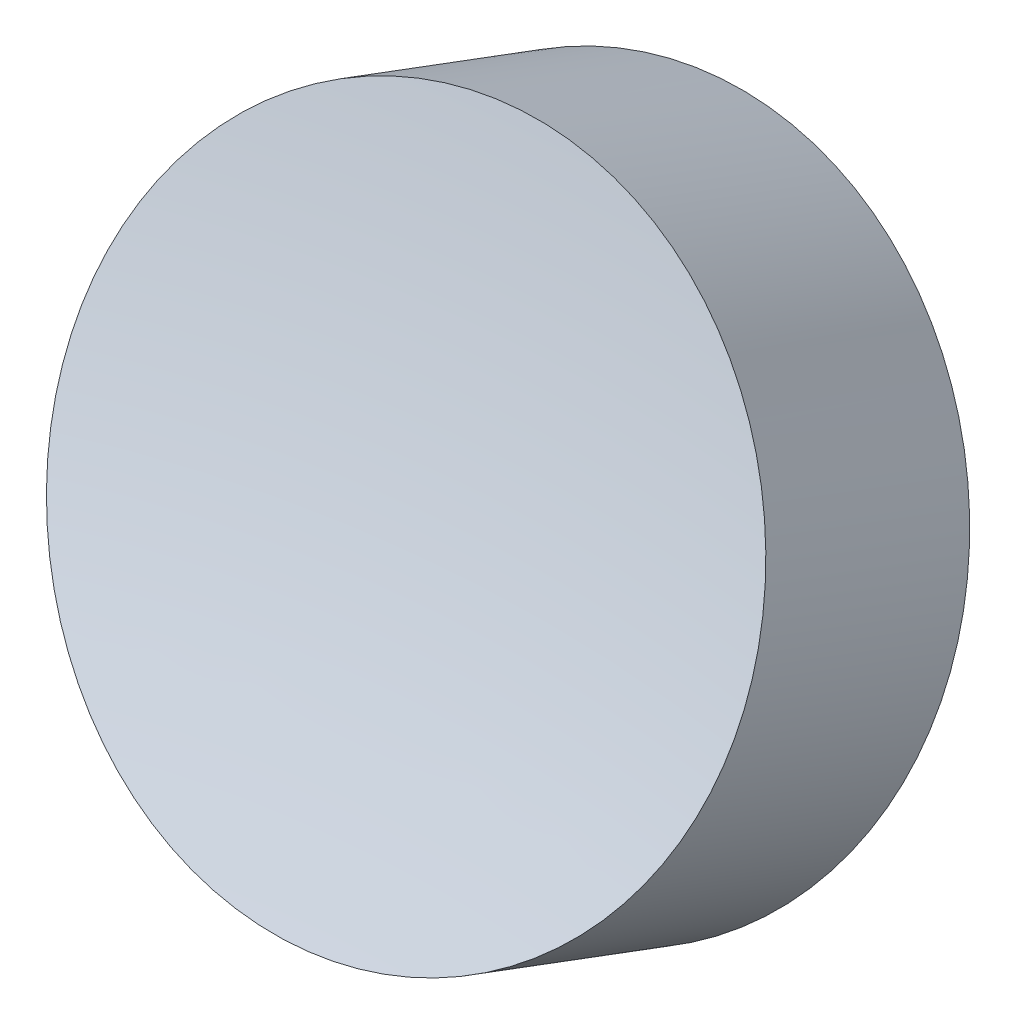
ISO-10303-21;
HEADER;
FILE_DESCRIPTION(('STEP AP214'),'2;1');
FILE_NAME('part.step','',(''),(''),'','','');
FILE_SCHEMA(('AUTOMOTIVE_DESIGN { 1 0 10303 214 1 1 1 1 }'));
ENDSEC;
DATA;
#1=APPLICATION_CONTEXT('core data for automotive mechanical design processes');
#2=APPLICATION_PROTOCOL_DEFINITION('international standard','automotive_design',2000,#1);
#3=PRODUCT_CONTEXT('',#1,'mechanical');
#4=PRODUCT('Part','Part','',(#3));
#5=PRODUCT_RELATED_PRODUCT_CATEGORY('part','',(#4));
#6=PRODUCT_DEFINITION_FORMATION('','',#4);
#7=PRODUCT_DEFINITION_CONTEXT('part definition',#1,'design');
#8=PRODUCT_DEFINITION('design','',#6,#7);
#9=PRODUCT_DEFINITION_SHAPE('','',#8);
#10=(LENGTH_UNIT() NAMED_UNIT(*) SI_UNIT(.MILLI.,.METRE.));
#11=(NAMED_UNIT(*) PLANE_ANGLE_UNIT() SI_UNIT($,.RADIAN.));
#12=(NAMED_UNIT(*) SI_UNIT($,.STERADIAN.) SOLID_ANGLE_UNIT());
#13=UNCERTAINTY_MEASURE_WITH_UNIT(LENGTH_MEASURE(1.E-05),#10,'distance_accuracy_value','');
#14=(GEOMETRIC_REPRESENTATION_CONTEXT(3) GLOBAL_UNCERTAINTY_ASSIGNED_CONTEXT((#13)) GLOBAL_UNIT_ASSIGNED_CONTEXT((#10,
#11,#12)) REPRESENTATION_CONTEXT('',''));
#15=CARTESIAN_POINT('',(0.,0.,0.));
#16=DIRECTION('',(0.,0.,1.));
#17=DIRECTION('',(1.,0.,0.));
#18=AXIS2_PLACEMENT_3D('',#15,#16,#17);
#19=CARTESIAN_POINT('',(-2.03871082646788,142.48814292537,346.880327692149));
#20=DIRECTION('',(0.0622709564623499,0.383014202525075,0.921641171305484));
#21=DIRECTION('',(0.,-0.923433296037534,0.383758970930005));
#22=AXIS2_PLACEMENT_3D('',#19,#20,#21);
#23=CYLINDRICAL_SURFACE('',#22,12.5000000000002);
#24=CARTESIAN_POINT('',(-2.61398281011595,138.949778452276,338.366015805047));
#25=DIRECTION('',(0.0622709564623499,0.383014202525075,0.921641171305484));
#26=DIRECTION('',(0.,-0.923433296037534,0.383758970930005));
#27=AXIS2_PLACEMENT_3D('',#24,#25,#26);
#28=CIRCLE('',#27,12.5000000000004);
#29=CARTESIAN_POINT('',(-2.61398281011595,127.406862251806,343.163002941672));
#30=VERTEX_POINT('',#29);
#31=EDGE_CURVE('E10',#30,#30,#28,.T.);
#32=ORIENTED_EDGE('',*,*,#31,.F.);
#33=EDGE_LOOP('',(#32));
#34=FACE_BOUND('',#33,.T.);
#35=CARTESIAN_POINT('',(-2.02936433778751,142.545631008285,347.018660379879));
#36=DIRECTION('',(0.0622709564623499,0.383014202525075,0.921641171305484));
#37=DIRECTION('',(0.,-0.923433296037534,0.383758970930005));
#38=AXIS2_PLACEMENT_3D('',#35,#36,#37);
#39=CIRCLE('',#38,12.5);
#40=CARTESIAN_POINT('',(-2.02936433778751,131.002714807816,351.815647516504));
#41=VERTEX_POINT('',#40);
#42=EDGE_CURVE('E46',#41,#41,#39,.T.);
#43=ORIENTED_EDGE('',*,*,#42,.T.);
#44=EDGE_LOOP('',(#43));
#45=FACE_BOUND('',#44,.T.);
#46=ADVANCED_FACE('F32',(#34,#45),#23,.F.);
#47=CARTESIAN_POINT('',(9.86175819982345,138.65106547514,337.647227372878));
#48=DIRECTION('',(0.0622709564623499,0.383014202525075,0.921641171305484));
#49=DIRECTION('',(0.,-0.923433296037534,0.383758970930005));
#50=AXIS2_PLACEMENT_3D('',#47,#48,#49);
#51=PLANE('',#50);
#52=CARTESIAN_POINT('',(-2.61398281011594,138.949778452276,338.366015805047));
#53=DIRECTION('',(0.0622709564623499,0.383014202525075,0.921641171305484));
#54=DIRECTION('',(0.,-0.923433296037534,0.383758970930005));
#55=AXIS2_PLACEMENT_3D('',#52,#53,#54);
#56=CIRCLE('',#55,13.5000000000004);
#57=CARTESIAN_POINT('',(-2.61398281011594,126.483428955769,343.546761912602));
#58=VERTEX_POINT('',#57);
#59=EDGE_CURVE('E38',#58,#58,#56,.T.);
#60=ORIENTED_EDGE('',*,*,#59,.F.);
#61=EDGE_LOOP('',(#60));
#62=FACE_BOUND('',#61,.T.);
#63=ORIENTED_EDGE('',*,*,#31,.T.);
#64=EDGE_LOOP('',(#63));
#65=FACE_BOUND('',#64,.T.);
#66=ADVANCED_FACE('F64',(#62,#65),#51,.F.);
#67=CARTESIAN_POINT('',(-2.03871082646788,142.48814292537,346.880327692149));
#68=DIRECTION('',(0.0622709564623499,0.383014202525075,0.921641171305484));
#69=DIRECTION('',(0.,-0.923433296037534,0.383758970930005));
#70=AXIS2_PLACEMENT_3D('',#67,#68,#69);
#71=CYLINDRICAL_SURFACE('',#70,13.5000000000002);
#72=CARTESIAN_POINT('',(-1.99127324549244,142.779920477526,347.582427518101));
#73=DIRECTION('',(0.0622709564623499,0.383014202525075,0.921641171305484));
#74=DIRECTION('',(0.,-0.923433296037534,0.383758970930005));
#75=AXIS2_PLACEMENT_3D('',#72,#73,#74);
#76=CIRCLE('',#75,13.4999999999999);
#77=CARTESIAN_POINT('',(-1.99127324549244,130.31357098102,352.763173625657));
#78=VERTEX_POINT('',#77);
#79=EDGE_CURVE('E42',#78,#78,#76,.T.);
#80=ORIENTED_EDGE('',*,*,#79,.F.);
#81=EDGE_LOOP('',(#80));
#82=FACE_BOUND('',#81,.T.);
#83=ORIENTED_EDGE('',*,*,#59,.T.);
#84=EDGE_LOOP('',(#83));
#85=FACE_BOUND('',#84,.T.);
#86=ADVANCED_FACE('F60',(#82,#85),#71,.T.);
#87=CARTESIAN_POINT('',(5.43380394900818,188.449847228379,457.477268248808));
#88=DIRECTION('',(0.0622709564623499,0.383014202525075,0.921641171305484));
#89=DIRECTION('',(0.998059280795116,-0.0238970381708184,-0.0575030745734376));
#90=AXIS2_PLACEMENT_3D('',#87,#88,#89);
#91=SPHERICAL_SURFACE('',#90,120.);
#92=ORIENTED_EDGE('',*,*,#79,.T.);
#93=EDGE_LOOP('',(#92));
#94=FACE_BOUND('',#93,.T.);
#95=ADVANCED_FACE('F55',(#94),#91,.F.);
#96=CARTESIAN_POINT('',(5.43380394900818,188.449847228379,457.477268248808));
#97=DIRECTION('',(0.0622709564623499,0.383014202525075,0.921641171305484));
#98=DIRECTION('',(0.998059280795116,-0.0238970381708184,-0.0575030745734376));
#99=AXIS2_PLACEMENT_3D('',#96,#97,#98);
#100=SPHERICAL_SURFACE('',#99,120.5);
#101=ORIENTED_EDGE('',*,*,#42,.F.);
#102=EDGE_LOOP('',(#101));
#103=FACE_BOUND('',#102,.T.);
#104=ADVANCED_FACE('F53',(#103),#100,.T.);
#105=CLOSED_SHELL('',(#46,#66,#86,#95,#104));
#106=MANIFOLD_SOLID_BREP('B2',#105);
#107=ADVANCED_BREP_SHAPE_REPRESENTATION('',(#18,#106),#14);
#108=SHAPE_DEFINITION_REPRESENTATION(#9,#107);
ENDSEC;
END-ISO-10303-21;
